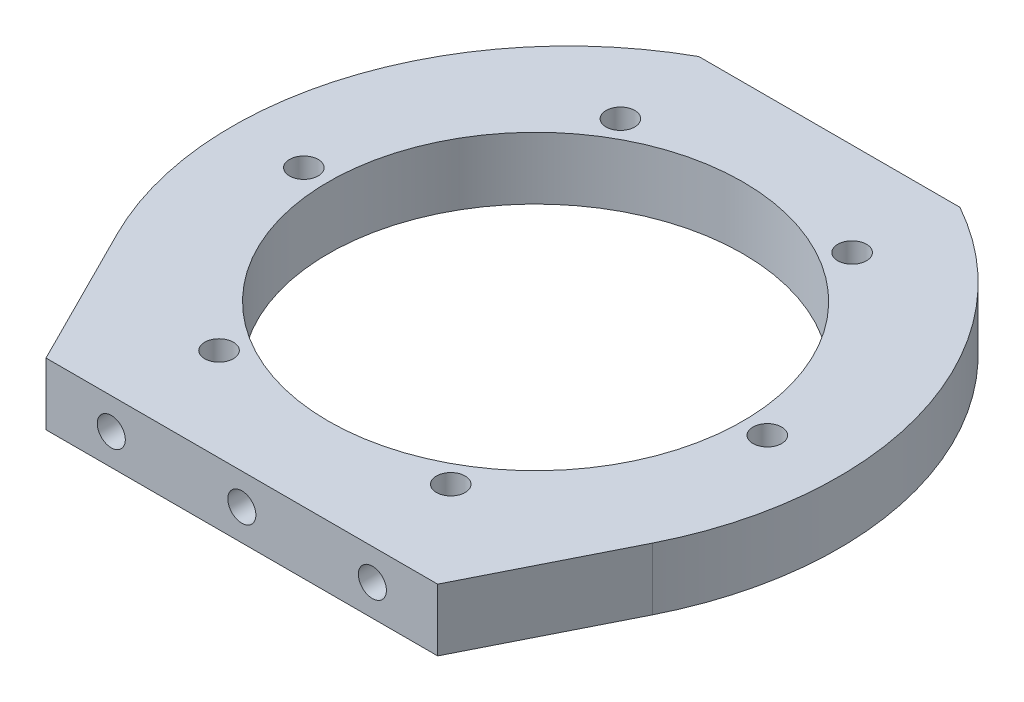
ISO-10303-21;
HEADER;
FILE_DESCRIPTION(('STEP AP214'),'2;1');
FILE_NAME('part.step','',(''),(''),'','','');
FILE_SCHEMA(('AUTOMOTIVE_DESIGN { 1 0 10303 214 1 1 1 1 }'));
ENDSEC;
DATA;
#1=APPLICATION_CONTEXT('core data for automotive mechanical design processes');
#2=APPLICATION_PROTOCOL_DEFINITION('international standard','automotive_design',2000,#1);
#3=PRODUCT_CONTEXT('',#1,'mechanical');
#4=PRODUCT('Part','Part','',(#3));
#5=PRODUCT_RELATED_PRODUCT_CATEGORY('part','',(#4));
#6=PRODUCT_DEFINITION_FORMATION('','',#4);
#7=PRODUCT_DEFINITION_CONTEXT('part definition',#1,'design');
#8=PRODUCT_DEFINITION('design','',#6,#7);
#9=PRODUCT_DEFINITION_SHAPE('','',#8);
#10=(LENGTH_UNIT() NAMED_UNIT(*) SI_UNIT(.MILLI.,.METRE.));
#11=(NAMED_UNIT(*) PLANE_ANGLE_UNIT() SI_UNIT($,.RADIAN.));
#12=(NAMED_UNIT(*) SI_UNIT($,.STERADIAN.) SOLID_ANGLE_UNIT());
#13=UNCERTAINTY_MEASURE_WITH_UNIT(LENGTH_MEASURE(1.E-05),#10,'distance_accuracy_value','');
#14=(GEOMETRIC_REPRESENTATION_CONTEXT(3) GLOBAL_UNCERTAINTY_ASSIGNED_CONTEXT((#13)) GLOBAL_UNIT_ASSIGNED_CONTEXT((#10,
#11,#12)) REPRESENTATION_CONTEXT('',''));
#15=CARTESIAN_POINT('',(0.,0.,0.));
#16=DIRECTION('',(0.,0.,1.));
#17=DIRECTION('',(1.,0.,0.));
#18=AXIS2_PLACEMENT_3D('',#15,#16,#17);
#19=CARTESIAN_POINT('',(-40.9977972178871,4.7625,23.1128243860878));
#20=DIRECTION('',(0.893540202746201,0.,-0.448983191307066));
#21=DIRECTION('',(-0.448983191307066,0.,-0.893540202746202));
#22=AXIS2_PLACEMENT_3D('',#19,#20,#21);
#23=PLANE('',#22);
#24=DIRECTION('',(0.448983191307066,0.,0.893540202746201));
#25=VECTOR('',#24,1.);
#26=CARTESIAN_POINT('',(-40.9977972178871,-4.7625,23.1128243860878));
#27=LINE('',#26,#25);
#28=CARTESIAN_POINT('',(-40.9977972178872,-4.7625,23.1128243860878));
#29=VERTEX_POINT('',#28);
#30=CARTESIAN_POINT('',(-30.,-4.7625,45.));
#31=VERTEX_POINT('',#30);
#32=EDGE_CURVE('E128',#29,#31,#27,.T.);
#33=ORIENTED_EDGE('',*,*,#32,.T.);
#34=DIRECTION('',(0.,-1.,0.));
#35=VECTOR('',#34,1.);
#36=CARTESIAN_POINT('',(-30.,4.7625,45.));
#37=LINE('',#36,#35);
#38=CARTESIAN_POINT('',(-30.,4.7625,45.));
#39=VERTEX_POINT('',#38);
#40=EDGE_CURVE('E11',#39,#31,#37,.T.);
#41=ORIENTED_EDGE('',*,*,#40,.F.);
#42=DIRECTION('',(0.448983191307066,0.,0.893540202746201));
#43=VECTOR('',#42,1.);
#44=CARTESIAN_POINT('',(-40.9977972178871,4.7625,23.1128243860878));
#45=LINE('',#44,#43);
#46=CARTESIAN_POINT('',(-40.9977972178872,4.7625,23.1128243860878));
#47=VERTEX_POINT('',#46);
#48=EDGE_CURVE('E145',#47,#39,#45,.T.);
#49=ORIENTED_EDGE('',*,*,#48,.F.);
#50=DIRECTION('',(0.,-1.,0.));
#51=VECTOR('',#50,1.);
#52=CARTESIAN_POINT('',(-40.9977972178872,4.7625,23.1128243860878));
#53=LINE('',#52,#51);
#54=EDGE_CURVE('E124',#47,#29,#53,.T.);
#55=ORIENTED_EDGE('',*,*,#54,.T.);
#56=EDGE_LOOP('',(#33,#41,#49,#55));
#57=FACE_BOUND('',#56,.T.);
#58=ADVANCED_FACE('F39',(#57),#23,.F.);
#59=CARTESIAN_POINT('',(-30.,4.7625,45.));
#60=DIRECTION('',(0.,0.,-1.));
#61=DIRECTION('',(-1.,0.,0.));
#62=AXIS2_PLACEMENT_3D('',#59,#60,#61);
#63=PLANE('',#62);
#64=CARTESIAN_POINT('',(-20.,0.,45.));
#65=DIRECTION('',(0.,0.,1.));
#66=DIRECTION('',(1.,0.,0.));
#67=AXIS2_PLACEMENT_3D('',#64,#65,#66);
#68=CIRCLE('',#67,2.15);
#69=CARTESIAN_POINT('',(-17.85,0.,45.));
#70=VERTEX_POINT('',#69);
#71=EDGE_CURVE('E452',#70,#70,#68,.T.);
#72=ORIENTED_EDGE('',*,*,#71,.F.);
#73=EDGE_LOOP('',(#72));
#74=FACE_BOUND('',#73,.T.);
#75=CARTESIAN_POINT('',(20.,0.,45.));
#76=DIRECTION('',(0.,0.,1.));
#77=DIRECTION('',(-1.,0.,0.));
#78=AXIS2_PLACEMENT_3D('',#75,#76,#77);
#79=CIRCLE('',#78,2.15);
#80=CARTESIAN_POINT('',(17.85,0.,45.));
#81=VERTEX_POINT('',#80);
#82=EDGE_CURVE('E444',#81,#81,#79,.T.);
#83=ORIENTED_EDGE('',*,*,#82,.F.);
#84=EDGE_LOOP('',(#83));
#85=FACE_BOUND('',#84,.T.);
#86=CARTESIAN_POINT('',(0.,0.,45.));
#87=DIRECTION('',(0.,0.,1.));
#88=DIRECTION('',(1.,0.,0.));
#89=AXIS2_PLACEMENT_3D('',#86,#87,#88);
#90=CIRCLE('',#89,2.15);
#91=CARTESIAN_POINT('',(2.15,0.,45.));
#92=VERTEX_POINT('',#91);
#93=EDGE_CURVE('E436',#92,#92,#90,.T.);
#94=ORIENTED_EDGE('',*,*,#93,.F.);
#95=EDGE_LOOP('',(#94));
#96=FACE_BOUND('',#95,.T.);
#97=DIRECTION('',(1.,0.,0.));
#98=VECTOR('',#97,1.);
#99=CARTESIAN_POINT('',(-30.,-4.7625,45.));
#100=LINE('',#99,#98);
#101=CARTESIAN_POINT('',(30.,-4.7625,45.));
#102=VERTEX_POINT('',#101);
#103=EDGE_CURVE('E132',#31,#102,#100,.T.);
#104=ORIENTED_EDGE('',*,*,#103,.T.);
#105=DIRECTION('',(0.,-1.,0.));
#106=VECTOR('',#105,1.);
#107=CARTESIAN_POINT('',(30.,4.7625,45.));
#108=LINE('',#107,#106);
#109=CARTESIAN_POINT('',(30.,4.7625,45.));
#110=VERTEX_POINT('',#109);
#111=EDGE_CURVE('E48',#110,#102,#108,.T.);
#112=ORIENTED_EDGE('',*,*,#111,.F.);
#113=DIRECTION('',(1.,0.,0.));
#114=VECTOR('',#113,1.);
#115=CARTESIAN_POINT('',(-30.,4.7625,45.));
#116=LINE('',#115,#114);
#117=EDGE_CURVE('E93',#39,#110,#116,.T.);
#118=ORIENTED_EDGE('',*,*,#117,.F.);
#119=ORIENTED_EDGE('',*,*,#40,.T.);
#120=EDGE_LOOP('',(#104,#112,#118,#119));
#121=FACE_BOUND('',#120,.T.);
#122=ADVANCED_FACE('F175',(#74,#85,#96,#121),#63,.F.);
#123=CARTESIAN_POINT('',(40.9977972178871,4.7625,23.1128243860878));
#124=DIRECTION('',(-0.893540202746202,0.,-0.448983191307065));
#125=DIRECTION('',(-0.448983191307065,0.,0.893540202746202));
#126=AXIS2_PLACEMENT_3D('',#123,#124,#125);
#127=PLANE('',#126);
#128=DIRECTION('',(0.448983191307065,0.,-0.893540202746202));
#129=VECTOR('',#128,1.);
#130=CARTESIAN_POINT('',(40.9977972178871,-4.7625,23.1128243860878));
#131=LINE('',#130,#129);
#132=CARTESIAN_POINT('',(40.9977972178871,-4.7625,23.1128243860878));
#133=VERTEX_POINT('',#132);
#134=EDGE_CURVE('E136',#102,#133,#131,.T.);
#135=ORIENTED_EDGE('',*,*,#134,.T.);
#136=DIRECTION('',(0.,-1.,0.));
#137=VECTOR('',#136,1.);
#138=CARTESIAN_POINT('',(40.9977972178871,4.7625,23.1128243860878));
#139=LINE('',#138,#137);
#140=CARTESIAN_POINT('',(40.9977972178871,4.7625,23.1128243860878));
#141=VERTEX_POINT('',#140);
#142=EDGE_CURVE('E117',#141,#133,#139,.T.);
#143=ORIENTED_EDGE('',*,*,#142,.F.);
#144=DIRECTION('',(0.448983191307065,0.,-0.893540202746202));
#145=VECTOR('',#144,1.);
#146=CARTESIAN_POINT('',(40.9977972178871,4.7625,23.1128243860878));
#147=LINE('',#146,#145);
#148=EDGE_CURVE('E106',#110,#141,#147,.T.);
#149=ORIENTED_EDGE('',*,*,#148,.F.);
#150=ORIENTED_EDGE('',*,*,#111,.T.);
#151=EDGE_LOOP('',(#135,#143,#149,#150));
#152=FACE_BOUND('',#151,.T.);
#153=ADVANCED_FACE('F155',(#152),#127,.F.);
#154=CARTESIAN_POINT('',(-5.,4.7625,0.));
#155=DIRECTION('',(0.,-1.,0.));
#156=DIRECTION('',(0.,0.,-1.));
#157=AXIS2_PLACEMENT_3D('',#154,#155,#156);
#158=CYLINDRICAL_SURFACE('',#157,51.478150704935);
#159=CARTESIAN_POINT('',(-5.,-4.7625,0.));
#160=DIRECTION('',(0.,1.,0.));
#161=DIRECTION('',(0.,0.,-1.));
#162=AXIS2_PLACEMENT_3D('',#159,#160,#161);
#163=CIRCLE('',#162,51.478150704935);
#164=CARTESIAN_POINT('',(20.,-4.7625,-45.));
#165=VERTEX_POINT('',#164);
#166=EDGE_CURVE('E115',#133,#165,#163,.T.);
#167=ORIENTED_EDGE('',*,*,#166,.T.);
#168=DIRECTION('',(0.,-1.,0.));
#169=VECTOR('',#168,1.);
#170=CARTESIAN_POINT('',(20.,4.7625,-45.));
#171=LINE('',#170,#169);
#172=CARTESIAN_POINT('',(20.,4.7625,-45.));
#173=VERTEX_POINT('',#172);
#174=EDGE_CURVE('E112',#173,#165,#171,.T.);
#175=ORIENTED_EDGE('',*,*,#174,.F.);
#176=CARTESIAN_POINT('',(-5.,4.7625,0.));
#177=DIRECTION('',(0.,1.,0.));
#178=DIRECTION('',(0.,0.,-1.));
#179=AXIS2_PLACEMENT_3D('',#176,#177,#178);
#180=CIRCLE('',#179,51.478150704935);
#181=EDGE_CURVE('E100',#141,#173,#180,.T.);
#182=ORIENTED_EDGE('',*,*,#181,.F.);
#183=ORIENTED_EDGE('',*,*,#142,.T.);
#184=EDGE_LOOP('',(#167,#175,#182,#183));
#185=FACE_BOUND('',#184,.T.);
#186=ADVANCED_FACE('F113',(#185),#158,.T.);
#187=CARTESIAN_POINT('',(-20.,4.7625,-45.));
#188=DIRECTION('',(0.,0.,1.));
#189=DIRECTION('',(1.,0.,0.));
#190=AXIS2_PLACEMENT_3D('',#187,#188,#189);
#191=PLANE('',#190);
#192=CARTESIAN_POINT('',(12.,0.,-45.));
#193=DIRECTION('',(0.,0.,-1.));
#194=DIRECTION('',(-1.,0.,0.));
#195=AXIS2_PLACEMENT_3D('',#192,#193,#194);
#196=CIRCLE('',#195,2.15);
#197=CARTESIAN_POINT('',(9.85000000000001,0.,-45.));
#198=VERTEX_POINT('',#197);
#199=EDGE_CURVE('E429',#198,#198,#196,.T.);
#200=ORIENTED_EDGE('',*,*,#199,.F.);
#201=EDGE_LOOP('',(#200));
#202=FACE_BOUND('',#201,.T.);
#203=CARTESIAN_POINT('',(-12.,0.,-45.));
#204=DIRECTION('',(0.,0.,-1.));
#205=DIRECTION('',(1.,0.,0.));
#206=AXIS2_PLACEMENT_3D('',#203,#204,#205);
#207=CIRCLE('',#206,2.15);
#208=CARTESIAN_POINT('',(-9.84999999999999,0.,-45.));
#209=VERTEX_POINT('',#208);
#210=EDGE_CURVE('E420',#209,#209,#207,.T.);
#211=ORIENTED_EDGE('',*,*,#210,.F.);
#212=EDGE_LOOP('',(#211));
#213=FACE_BOUND('',#212,.T.);
#214=DIRECTION('',(-1.,0.,0.));
#215=VECTOR('',#214,1.);
#216=CARTESIAN_POINT('',(-20.,-4.7625,-45.));
#217=LINE('',#216,#215);
#218=CARTESIAN_POINT('',(-20.,-4.7625,-45.));
#219=VERTEX_POINT('',#218);
#220=EDGE_CURVE('E79',#165,#219,#217,.T.);
#221=ORIENTED_EDGE('',*,*,#220,.T.);
#222=DIRECTION('',(0.,-1.,0.));
#223=VECTOR('',#222,1.);
#224=CARTESIAN_POINT('',(-20.,4.7625,-45.));
#225=LINE('',#224,#223);
#226=CARTESIAN_POINT('',(-20.,4.7625,-45.));
#227=VERTEX_POINT('',#226);
#228=EDGE_CURVE('E118',#227,#219,#225,.T.);
#229=ORIENTED_EDGE('',*,*,#228,.F.);
#230=DIRECTION('',(-1.,0.,0.));
#231=VECTOR('',#230,1.);
#232=CARTESIAN_POINT('',(-20.,4.7625,-45.));
#233=LINE('',#232,#231);
#234=EDGE_CURVE('E104',#173,#227,#233,.T.);
#235=ORIENTED_EDGE('',*,*,#234,.F.);
#236=ORIENTED_EDGE('',*,*,#174,.T.);
#237=EDGE_LOOP('',(#221,#229,#235,#236));
#238=FACE_BOUND('',#237,.T.);
#239=ADVANCED_FACE('F120',(#202,#213,#238),#191,.F.);
#240=CARTESIAN_POINT('',(5.,4.7625,0.));
#241=DIRECTION('',(0.,-1.,0.));
#242=DIRECTION('',(0.,0.,-1.));
#243=AXIS2_PLACEMENT_3D('',#240,#241,#242);
#244=CYLINDRICAL_SURFACE('',#243,51.478150704935);
#245=CARTESIAN_POINT('',(5.,-4.7625,0.));
#246=DIRECTION('',(0.,1.,0.));
#247=DIRECTION('',(0.,0.,1.));
#248=AXIS2_PLACEMENT_3D('',#245,#246,#247);
#249=CIRCLE('',#248,51.478150704935);
#250=EDGE_CURVE('E85',#219,#29,#249,.T.);
#251=ORIENTED_EDGE('',*,*,#250,.T.);
#252=ORIENTED_EDGE('',*,*,#54,.F.);
#253=CARTESIAN_POINT('',(5.,4.7625,0.));
#254=DIRECTION('',(0.,1.,0.));
#255=DIRECTION('',(0.,0.,1.));
#256=AXIS2_PLACEMENT_3D('',#253,#254,#255);
#257=CIRCLE('',#256,51.478150704935);
#258=EDGE_CURVE('E56',#227,#47,#257,.T.);
#259=ORIENTED_EDGE('',*,*,#258,.F.);
#260=ORIENTED_EDGE('',*,*,#228,.T.);
#261=EDGE_LOOP('',(#251,#252,#259,#260));
#262=FACE_BOUND('',#261,.T.);
#263=ADVANCED_FACE('F162',(#262),#244,.T.);
#264=CARTESIAN_POINT('',(-5.,4.7625,0.));
#265=DIRECTION('',(0.,-1.,0.));
#266=DIRECTION('',(0.,0.,-1.));
#267=AXIS2_PLACEMENT_3D('',#264,#265,#266);
#268=PLANE('',#267);
#269=CARTESIAN_POINT('',(-17.7499999999993,4.7625,-30.7439018343462));
#270=DIRECTION('',(0.,1.,0.));
#271=DIRECTION('',(0.,0.,1.));
#272=AXIS2_PLACEMENT_3D('',#269,#270,#271);
#273=CIRCLE('',#272,2.2);
#274=CARTESIAN_POINT('',(-17.7499999999993,4.7625,-28.5439018343462));
#275=VERTEX_POINT('',#274);
#276=EDGE_CURVE('E392',#275,#275,#273,.T.);
#277=ORIENTED_EDGE('',*,*,#276,.F.);
#278=EDGE_LOOP('',(#277));
#279=FACE_BOUND('',#278,.T.);
#280=CARTESIAN_POINT('',(-35.4999999999977,4.7625,1.41206490944512E-12));
#281=DIRECTION('',(0.,1.,0.));
#282=DIRECTION('',(0.,0.,1.));
#283=AXIS2_PLACEMENT_3D('',#280,#281,#282);
#284=CIRCLE('',#283,2.2);
#285=CARTESIAN_POINT('',(-35.4999999999977,4.7625,2.20000000000141));
#286=VERTEX_POINT('',#285);
#287=EDGE_CURVE('E391',#286,#286,#284,.T.);
#288=ORIENTED_EDGE('',*,*,#287,.F.);
#289=EDGE_LOOP('',(#288));
#290=FACE_BOUND('',#289,.T.);
#291=CARTESIAN_POINT('',(-17.7499999999969,4.7625,30.7439018343476));
#292=DIRECTION('',(0.,1.,0.));
#293=DIRECTION('',(0.,0.,1.));
#294=AXIS2_PLACEMENT_3D('',#291,#292,#293);
#295=CIRCLE('',#294,2.2);
#296=CARTESIAN_POINT('',(-17.7499999999969,4.7625,32.9439018343476));
#297=VERTEX_POINT('',#296);
#298=EDGE_CURVE('E399',#297,#297,#295,.T.);
#299=ORIENTED_EDGE('',*,*,#298,.F.);
#300=EDGE_LOOP('',(#299));
#301=FACE_BOUND('',#300,.T.);
#302=CARTESIAN_POINT('',(17.7500000000023,4.7625,30.7439018343462));
#303=DIRECTION('',(0.,1.,0.));
#304=DIRECTION('',(0.,0.,1.));
#305=AXIS2_PLACEMENT_3D('',#302,#303,#304);
#306=CIRCLE('',#305,2.2);
#307=CARTESIAN_POINT('',(17.7500000000023,4.7625,32.9439018343462));
#308=VERTEX_POINT('',#307);
#309=EDGE_CURVE('E405',#308,#308,#306,.T.);
#310=ORIENTED_EDGE('',*,*,#309,.F.);
#311=EDGE_LOOP('',(#310));
#312=FACE_BOUND('',#311,.T.);
#313=CARTESIAN_POINT('',(35.5000000000007,4.7625,-1.40859546249317E-12));
#314=DIRECTION('',(0.,1.,0.));
#315=DIRECTION('',(0.,0.,1.));
#316=AXIS2_PLACEMENT_3D('',#313,#314,#315);
#317=CIRCLE('',#316,2.2);
#318=CARTESIAN_POINT('',(35.5000000000007,4.7625,2.19999999999859));
#319=VERTEX_POINT('',#318);
#320=EDGE_CURVE('E411',#319,#319,#317,.T.);
#321=ORIENTED_EDGE('',*,*,#320,.F.);
#322=EDGE_LOOP('',(#321));
#323=FACE_BOUND('',#322,.T.);
#324=CARTESIAN_POINT('',(17.7499999999999,4.7625,-30.7439018343476));
#325=DIRECTION('',(0.,1.,0.));
#326=DIRECTION('',(0.,0.,1.));
#327=AXIS2_PLACEMENT_3D('',#324,#325,#326);
#328=CIRCLE('',#327,2.2);
#329=CARTESIAN_POINT('',(17.7499999999999,4.7625,-28.5439018343476));
#330=VERTEX_POINT('',#329);
#331=EDGE_CURVE('E385',#330,#330,#328,.T.);
#332=ORIENTED_EDGE('',*,*,#331,.F.);
#333=EDGE_LOOP('',(#332));
#334=FACE_BOUND('',#333,.T.);
#335=CARTESIAN_POINT('',(0.,4.7625,0.));
#336=DIRECTION('',(0.,1.,0.));
#337=DIRECTION('',(0.,0.,1.));
#338=AXIS2_PLACEMENT_3D('',#335,#336,#337);
#339=CIRCLE('',#338,31.75);
#340=CARTESIAN_POINT('',(0.,4.7625,31.75));
#341=VERTEX_POINT('',#340);
#342=EDGE_CURVE('E372',#341,#341,#339,.T.);
#343=ORIENTED_EDGE('',*,*,#342,.F.);
#344=EDGE_LOOP('',(#343));
#345=FACE_BOUND('',#344,.T.);
#346=ORIENTED_EDGE('',*,*,#48,.T.);
#347=ORIENTED_EDGE('',*,*,#117,.T.);
#348=ORIENTED_EDGE('',*,*,#148,.T.);
#349=ORIENTED_EDGE('',*,*,#181,.T.);
#350=ORIENTED_EDGE('',*,*,#234,.T.);
#351=ORIENTED_EDGE('',*,*,#258,.T.);
#352=EDGE_LOOP('',(#346,#347,#348,#349,#350,#351));
#353=FACE_BOUND('',#352,.T.);
#354=ADVANCED_FACE('F102',(#279,#290,#301,#312,#323,#334,#345,#353),#268,.F.);
#355=CARTESIAN_POINT('',(-5.,-4.7625,0.));
#356=DIRECTION('',(0.,-1.,0.));
#357=DIRECTION('',(0.,0.,-1.));
#358=AXIS2_PLACEMENT_3D('',#355,#356,#357);
#359=PLANE('',#358);
#360=CARTESIAN_POINT('',(-17.7499999999993,-4.7625,-30.7439018343462));
#361=DIRECTION('',(0.,-1.,0.));
#362=DIRECTION('',(0.,0.,-1.));
#363=AXIS2_PLACEMENT_3D('',#360,#361,#362);
#364=CIRCLE('',#363,2.2);
#365=CARTESIAN_POINT('',(-17.7499999999993,-4.7625,-32.9439018343462));
#366=VERTEX_POINT('',#365);
#367=EDGE_CURVE('E347',#366,#366,#364,.F.);
#368=ORIENTED_EDGE('',*,*,#367,.T.);
#369=EDGE_LOOP('',(#368));
#370=FACE_BOUND('',#369,.T.);
#371=CARTESIAN_POINT('',(-35.4999999999977,-4.7625,1.41206490944512E-12));
#372=DIRECTION('',(0.,-1.,0.));
#373=DIRECTION('',(0.,0.,-1.));
#374=AXIS2_PLACEMENT_3D('',#371,#372,#373);
#375=CIRCLE('',#374,2.2);
#376=CARTESIAN_POINT('',(-35.4999999999977,-4.7625,-2.19999999999859));
#377=VERTEX_POINT('',#376);
#378=EDGE_CURVE('E351',#377,#377,#375,.F.);
#379=ORIENTED_EDGE('',*,*,#378,.T.);
#380=EDGE_LOOP('',(#379));
#381=FACE_BOUND('',#380,.T.);
#382=CARTESIAN_POINT('',(-17.7499999999969,-4.7625,30.7439018343476));
#383=DIRECTION('',(0.,-1.,0.));
#384=DIRECTION('',(0.,0.,-1.));
#385=AXIS2_PLACEMENT_3D('',#382,#383,#384);
#386=CIRCLE('',#385,2.2);
#387=CARTESIAN_POINT('',(-17.7499999999969,-4.7625,28.5439018343476));
#388=VERTEX_POINT('',#387);
#389=EDGE_CURVE('E355',#388,#388,#386,.F.);
#390=ORIENTED_EDGE('',*,*,#389,.T.);
#391=EDGE_LOOP('',(#390));
#392=FACE_BOUND('',#391,.T.);
#393=CARTESIAN_POINT('',(17.7500000000023,-4.7625,30.7439018343462));
#394=DIRECTION('',(0.,-1.,0.));
#395=DIRECTION('',(0.,0.,-1.));
#396=AXIS2_PLACEMENT_3D('',#393,#394,#395);
#397=CIRCLE('',#396,2.2);
#398=CARTESIAN_POINT('',(17.7500000000023,-4.7625,28.5439018343462));
#399=VERTEX_POINT('',#398);
#400=EDGE_CURVE('E359',#399,#399,#397,.F.);
#401=ORIENTED_EDGE('',*,*,#400,.T.);
#402=EDGE_LOOP('',(#401));
#403=FACE_BOUND('',#402,.T.);
#404=CARTESIAN_POINT('',(35.5000000000007,-4.7625,-1.40859546249317E-12));
#405=DIRECTION('',(0.,-1.,0.));
#406=DIRECTION('',(0.,0.,-1.));
#407=AXIS2_PLACEMENT_3D('',#404,#405,#406);
#408=CIRCLE('',#407,2.2);
#409=CARTESIAN_POINT('',(35.5000000000007,-4.7625,-2.20000000000141));
#410=VERTEX_POINT('',#409);
#411=EDGE_CURVE('E363',#410,#410,#408,.F.);
#412=ORIENTED_EDGE('',*,*,#411,.T.);
#413=EDGE_LOOP('',(#412));
#414=FACE_BOUND('',#413,.T.);
#415=CARTESIAN_POINT('',(17.7499999999999,-4.7625,-30.7439018343476));
#416=DIRECTION('',(0.,-1.,0.));
#417=DIRECTION('',(0.,0.,-1.));
#418=AXIS2_PLACEMENT_3D('',#415,#416,#417);
#419=CIRCLE('',#418,2.2);
#420=CARTESIAN_POINT('',(17.7499999999999,-4.7625,-32.9439018343476));
#421=VERTEX_POINT('',#420);
#422=EDGE_CURVE('E367',#421,#421,#419,.F.);
#423=ORIENTED_EDGE('',*,*,#422,.T.);
#424=EDGE_LOOP('',(#423));
#425=FACE_BOUND('',#424,.T.);
#426=CARTESIAN_POINT('',(0.,-4.7625,0.));
#427=DIRECTION('',(0.,-1.,0.));
#428=DIRECTION('',(0.,0.,-1.));
#429=AXIS2_PLACEMENT_3D('',#426,#427,#428);
#430=CIRCLE('',#429,31.75);
#431=CARTESIAN_POINT('',(0.,-4.7625,-31.75));
#432=VERTEX_POINT('',#431);
#433=EDGE_CURVE('E133',#432,#432,#430,.F.);
#434=ORIENTED_EDGE('',*,*,#433,.T.);
#435=EDGE_LOOP('',(#434));
#436=FACE_BOUND('',#435,.T.);
#437=ORIENTED_EDGE('',*,*,#32,.F.);
#438=ORIENTED_EDGE('',*,*,#250,.F.);
#439=ORIENTED_EDGE('',*,*,#220,.F.);
#440=ORIENTED_EDGE('',*,*,#166,.F.);
#441=ORIENTED_EDGE('',*,*,#134,.F.);
#442=ORIENTED_EDGE('',*,*,#103,.F.);
#443=EDGE_LOOP('',(#437,#438,#439,#440,#441,#442));
#444=FACE_BOUND('',#443,.T.);
#445=ADVANCED_FACE('F158',(#370,#381,#392,#403,#414,#425,#436,#444),#359,.T.);
#446=CARTESIAN_POINT('',(0.,-94.5650612106915,0.));
#447=DIRECTION('',(0.,1.,0.));
#448=DIRECTION('',(0.,0.,1.));
#449=AXIS2_PLACEMENT_3D('',#446,#447,#448);
#450=CYLINDRICAL_SURFACE('',#449,31.75);
#451=ORIENTED_EDGE('',*,*,#342,.T.);
#452=EDGE_LOOP('',(#451));
#453=FACE_BOUND('',#452,.T.);
#454=ORIENTED_EDGE('',*,*,#433,.F.);
#455=EDGE_LOOP('',(#454));
#456=FACE_BOUND('',#455,.T.);
#457=ADVANCED_FACE('F336',(#453,#456),#450,.F.);
#458=CARTESIAN_POINT('',(17.7499999999999,-10.9850396744416,-30.7439018343476));
#459=DIRECTION('',(0.,1.,0.));
#460=DIRECTION('',(0.,0.,1.));
#461=AXIS2_PLACEMENT_3D('',#458,#459,#460);
#462=CYLINDRICAL_SURFACE('',#461,2.2);
#463=ORIENTED_EDGE('',*,*,#331,.T.);
#464=EDGE_LOOP('',(#463));
#465=FACE_BOUND('',#464,.T.);
#466=ORIENTED_EDGE('',*,*,#422,.F.);
#467=EDGE_LOOP('',(#466));
#468=FACE_BOUND('',#467,.T.);
#469=ADVANCED_FACE('F319',(#465,#468),#462,.F.);
#470=CARTESIAN_POINT('',(35.5000000000007,-10.9850396744416,-1.40859546249317E-12));
#471=DIRECTION('',(0.,1.,0.));
#472=DIRECTION('',(0.,0.,1.));
#473=AXIS2_PLACEMENT_3D('',#470,#471,#472);
#474=CYLINDRICAL_SURFACE('',#473,2.2);
#475=ORIENTED_EDGE('',*,*,#320,.T.);
#476=EDGE_LOOP('',(#475));
#477=FACE_BOUND('',#476,.T.);
#478=ORIENTED_EDGE('',*,*,#411,.F.);
#479=EDGE_LOOP('',(#478));
#480=FACE_BOUND('',#479,.T.);
#481=ADVANCED_FACE('F315',(#477,#480),#474,.F.);
#482=CARTESIAN_POINT('',(17.7500000000023,-10.9850396744416,30.7439018343462));
#483=DIRECTION('',(0.,1.,0.));
#484=DIRECTION('',(0.,0.,1.));
#485=AXIS2_PLACEMENT_3D('',#482,#483,#484);
#486=CYLINDRICAL_SURFACE('',#485,2.2);
#487=ORIENTED_EDGE('',*,*,#309,.T.);
#488=EDGE_LOOP('',(#487));
#489=FACE_BOUND('',#488,.T.);
#490=ORIENTED_EDGE('',*,*,#400,.F.);
#491=EDGE_LOOP('',(#490));
#492=FACE_BOUND('',#491,.T.);
#493=ADVANCED_FACE('F318',(#489,#492),#486,.F.);
#494=CARTESIAN_POINT('',(-17.7499999999969,-10.9850396744416,30.7439018343476));
#495=DIRECTION('',(0.,1.,0.));
#496=DIRECTION('',(0.,0.,1.));
#497=AXIS2_PLACEMENT_3D('',#494,#495,#496);
#498=CYLINDRICAL_SURFACE('',#497,2.2);
#499=ORIENTED_EDGE('',*,*,#298,.T.);
#500=EDGE_LOOP('',(#499));
#501=FACE_BOUND('',#500,.T.);
#502=ORIENTED_EDGE('',*,*,#389,.F.);
#503=EDGE_LOOP('',(#502));
#504=FACE_BOUND('',#503,.T.);
#505=ADVANCED_FACE('F323',(#501,#504),#498,.F.);
#506=CARTESIAN_POINT('',(-35.4999999999977,-10.9850396744416,1.41206490944512E-12));
#507=DIRECTION('',(0.,1.,0.));
#508=DIRECTION('',(0.,0.,1.));
#509=AXIS2_PLACEMENT_3D('',#506,#507,#508);
#510=CYLINDRICAL_SURFACE('',#509,2.2);
#511=ORIENTED_EDGE('',*,*,#287,.T.);
#512=EDGE_LOOP('',(#511));
#513=FACE_BOUND('',#512,.T.);
#514=ORIENTED_EDGE('',*,*,#378,.F.);
#515=EDGE_LOOP('',(#514));
#516=FACE_BOUND('',#515,.T.);
#517=ADVANCED_FACE('F327',(#513,#516),#510,.F.);
#518=CARTESIAN_POINT('',(-17.7499999999993,-10.9850396744416,-30.7439018343462));
#519=DIRECTION('',(0.,1.,0.));
#520=DIRECTION('',(0.,0.,1.));
#521=AXIS2_PLACEMENT_3D('',#518,#519,#520);
#522=CYLINDRICAL_SURFACE('',#521,2.2);
#523=ORIENTED_EDGE('',*,*,#276,.T.);
#524=EDGE_LOOP('',(#523));
#525=FACE_BOUND('',#524,.T.);
#526=ORIENTED_EDGE('',*,*,#367,.F.);
#527=EDGE_LOOP('',(#526));
#528=FACE_BOUND('',#527,.T.);
#529=ADVANCED_FACE('F203',(#525,#528),#522,.F.);
#530=CARTESIAN_POINT('',(-12.,0.,-37.));
#531=DIRECTION('',(0.,0.,-1.));
#532=DIRECTION('',(-1.,0.,0.));
#533=AXIS2_PLACEMENT_3D('',#530,#531,#532);
#534=CYLINDRICAL_SURFACE('',#533,2.15);
#535=CARTESIAN_POINT('',(-12.,0.,-37.));
#536=DIRECTION('',(0.,0.,-1.));
#537=DIRECTION('',(1.,0.,0.));
#538=AXIS2_PLACEMENT_3D('',#535,#536,#537);
#539=CIRCLE('',#538,2.15);
#540=CARTESIAN_POINT('',(-9.84999999999999,0.,-37.));
#541=VERTEX_POINT('',#540);
#542=EDGE_CURVE('E424',#541,#541,#539,.T.);
#543=ORIENTED_EDGE('',*,*,#542,.F.);
#544=EDGE_LOOP('',(#543));
#545=FACE_BOUND('',#544,.T.);
#546=ORIENTED_EDGE('',*,*,#210,.T.);
#547=EDGE_LOOP('',(#546));
#548=FACE_BOUND('',#547,.T.);
#549=ADVANCED_FACE('F208',(#545,#548),#534,.F.);
#550=CARTESIAN_POINT('',(-12.,0.,-37.));
#551=DIRECTION('',(0.,0.,1.));
#552=DIRECTION('',(1.,0.,0.));
#553=AXIS2_PLACEMENT_3D('',#550,#551,#552);
#554=PLANE('',#553);
#555=ORIENTED_EDGE('',*,*,#542,.T.);
#556=EDGE_LOOP('',(#555));
#557=FACE_BOUND('',#556,.T.);
#558=ADVANCED_FACE('F213',(#557),#554,.F.);
#559=CARTESIAN_POINT('',(12.,0.,-37.));
#560=DIRECTION('',(0.,0.,-1.));
#561=DIRECTION('',(-1.,0.,0.));
#562=AXIS2_PLACEMENT_3D('',#559,#560,#561);
#563=CYLINDRICAL_SURFACE('',#562,2.15);
#564=CARTESIAN_POINT('',(12.,0.,-37.));
#565=DIRECTION('',(0.,0.,-1.));
#566=DIRECTION('',(-1.,0.,0.));
#567=AXIS2_PLACEMENT_3D('',#564,#565,#566);
#568=CIRCLE('',#567,2.15);
#569=CARTESIAN_POINT('',(9.85000000000001,0.,-37.));
#570=VERTEX_POINT('',#569);
#571=EDGE_CURVE('E396',#570,#570,#568,.T.);
#572=ORIENTED_EDGE('',*,*,#571,.F.);
#573=EDGE_LOOP('',(#572));
#574=FACE_BOUND('',#573,.T.);
#575=ORIENTED_EDGE('',*,*,#199,.T.);
#576=EDGE_LOOP('',(#575));
#577=FACE_BOUND('',#576,.T.);
#578=ADVANCED_FACE('F223',(#574,#577),#563,.F.);
#579=CARTESIAN_POINT('',(12.,0.,-37.));
#580=DIRECTION('',(0.,0.,-1.));
#581=DIRECTION('',(-1.,0.,0.));
#582=AXIS2_PLACEMENT_3D('',#579,#580,#581);
#583=PLANE('',#582);
#584=ORIENTED_EDGE('',*,*,#571,.T.);
#585=EDGE_LOOP('',(#584));
#586=FACE_BOUND('',#585,.T.);
#587=ADVANCED_FACE('F233',(#586),#583,.T.);
#588=CARTESIAN_POINT('',(0.,0.,37.));
#589=DIRECTION('',(0.,0.,1.));
#590=DIRECTION('',(1.,0.,0.));
#591=AXIS2_PLACEMENT_3D('',#588,#589,#590);
#592=CYLINDRICAL_SURFACE('',#591,2.15);
#593=CARTESIAN_POINT('',(0.,0.,37.));
#594=DIRECTION('',(0.,0.,1.));
#595=DIRECTION('',(1.,0.,0.));
#596=AXIS2_PLACEMENT_3D('',#593,#594,#595);
#597=CIRCLE('',#596,2.15);
#598=CARTESIAN_POINT('',(2.15,0.,37.));
#599=VERTEX_POINT('',#598);
#600=EDGE_CURVE('E440',#599,#599,#597,.T.);
#601=ORIENTED_EDGE('',*,*,#600,.F.);
#602=EDGE_LOOP('',(#601));
#603=FACE_BOUND('',#602,.T.);
#604=ORIENTED_EDGE('',*,*,#93,.T.);
#605=EDGE_LOOP('',(#604));
#606=FACE_BOUND('',#605,.T.);
#607=ADVANCED_FACE('F242',(#603,#606),#592,.F.);
#608=CARTESIAN_POINT('',(0.,0.,37.));
#609=DIRECTION('',(0.,0.,1.));
#610=DIRECTION('',(1.,0.,0.));
#611=AXIS2_PLACEMENT_3D('',#608,#609,#610);
#612=PLANE('',#611);
#613=ORIENTED_EDGE('',*,*,#600,.T.);
#614=EDGE_LOOP('',(#613));
#615=FACE_BOUND('',#614,.T.);
#616=ADVANCED_FACE('F259',(#615),#612,.T.);
#617=CARTESIAN_POINT('',(20.,0.,37.));
#618=DIRECTION('',(0.,0.,1.));
#619=DIRECTION('',(1.,0.,0.));
#620=AXIS2_PLACEMENT_3D('',#617,#618,#619);
#621=CYLINDRICAL_SURFACE('',#620,2.15);
#622=CARTESIAN_POINT('',(20.,0.,37.));
#623=DIRECTION('',(0.,0.,1.));
#624=DIRECTION('',(-1.,0.,0.));
#625=AXIS2_PLACEMENT_3D('',#622,#623,#624);
#626=CIRCLE('',#625,2.15);
#627=CARTESIAN_POINT('',(17.85,0.,37.));
#628=VERTEX_POINT('',#627);
#629=EDGE_CURVE('E448',#628,#628,#626,.T.);
#630=ORIENTED_EDGE('',*,*,#629,.F.);
#631=EDGE_LOOP('',(#630));
#632=FACE_BOUND('',#631,.T.);
#633=ORIENTED_EDGE('',*,*,#82,.T.);
#634=EDGE_LOOP('',(#633));
#635=FACE_BOUND('',#634,.T.);
#636=ADVANCED_FACE('F269',(#632,#635),#621,.F.);
#637=CARTESIAN_POINT('',(20.,0.,37.));
#638=DIRECTION('',(0.,0.,-1.));
#639=DIRECTION('',(-1.,0.,0.));
#640=AXIS2_PLACEMENT_3D('',#637,#638,#639);
#641=PLANE('',#640);
#642=ORIENTED_EDGE('',*,*,#629,.T.);
#643=EDGE_LOOP('',(#642));
#644=FACE_BOUND('',#643,.T.);
#645=ADVANCED_FACE('F279',(#644),#641,.F.);
#646=CARTESIAN_POINT('',(-20.,0.,37.));
#647=DIRECTION('',(0.,0.,1.));
#648=DIRECTION('',(1.,0.,0.));
#649=AXIS2_PLACEMENT_3D('',#646,#647,#648);
#650=CYLINDRICAL_SURFACE('',#649,2.15);
#651=CARTESIAN_POINT('',(-20.,0.,37.));
#652=DIRECTION('',(0.,0.,1.));
#653=DIRECTION('',(1.,0.,0.));
#654=AXIS2_PLACEMENT_3D('',#651,#652,#653);
#655=CIRCLE('',#654,2.15);
#656=CARTESIAN_POINT('',(-17.85,0.,37.));
#657=VERTEX_POINT('',#656);
#658=EDGE_CURVE('E425',#657,#657,#655,.T.);
#659=ORIENTED_EDGE('',*,*,#658,.F.);
#660=EDGE_LOOP('',(#659));
#661=FACE_BOUND('',#660,.T.);
#662=ORIENTED_EDGE('',*,*,#71,.T.);
#663=EDGE_LOOP('',(#662));
#664=FACE_BOUND('',#663,.T.);
#665=ADVANCED_FACE('F289',(#661,#664),#650,.F.);
#666=CARTESIAN_POINT('',(-20.,0.,37.));
#667=DIRECTION('',(0.,0.,1.));
#668=DIRECTION('',(1.,0.,0.));
#669=AXIS2_PLACEMENT_3D('',#666,#667,#668);
#670=PLANE('',#669);
#671=ORIENTED_EDGE('',*,*,#658,.T.);
#672=EDGE_LOOP('',(#671));
#673=FACE_BOUND('',#672,.T.);
#674=ADVANCED_FACE('F299',(#673),#670,.T.);
#675=CLOSED_SHELL('',(#58,#122,#153,#186,#239,#263,#354,#445,#457,#469,#481,#493,#505,#517,#529,
#549,#558,#578,#587,#607,#616,#636,#645,#665,#674));
#676=MANIFOLD_SOLID_BREP('B2',#675);
#677=ADVANCED_BREP_SHAPE_REPRESENTATION('',(#18,#676),#14);
#678=SHAPE_DEFINITION_REPRESENTATION(#9,#677);
ENDSEC;
END-ISO-10303-21;
